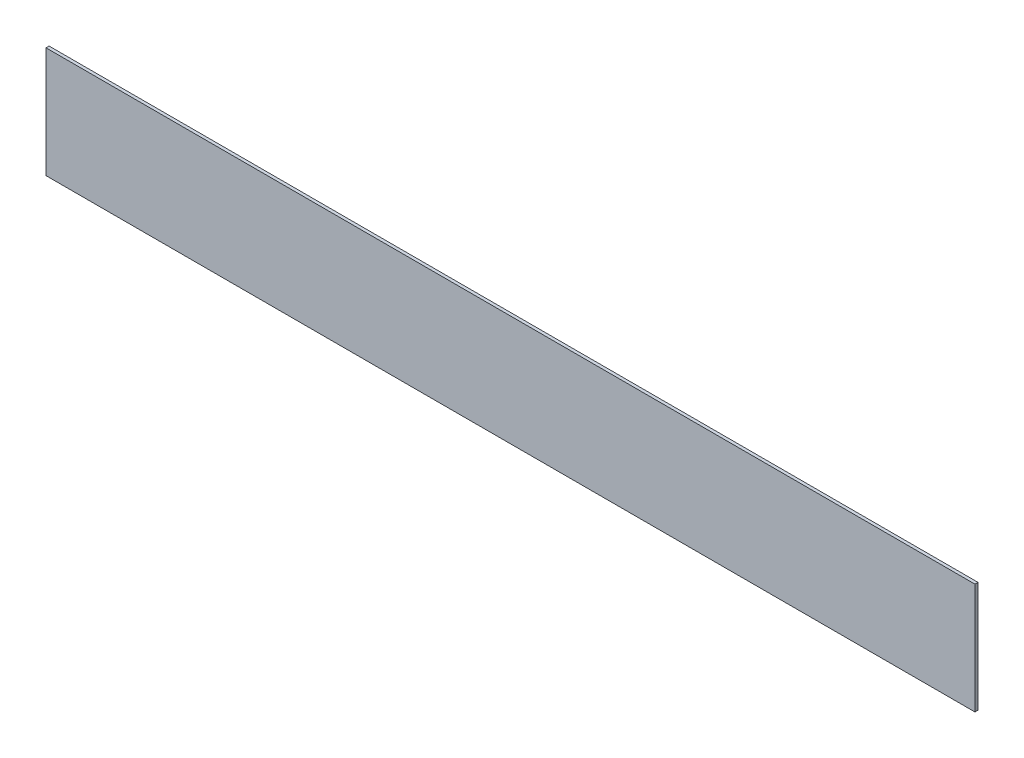
ISO-10303-21;
HEADER;
FILE_DESCRIPTION(('STEP AP214'),'2;1');
FILE_NAME('part.step','',(''),(''),'','','');
FILE_SCHEMA(('AUTOMOTIVE_DESIGN { 1 0 10303 214 1 1 1 1 }'));
ENDSEC;
DATA;
#1=APPLICATION_CONTEXT('core data for automotive mechanical design processes');
#2=APPLICATION_PROTOCOL_DEFINITION('international standard','automotive_design',2000,#1);
#3=PRODUCT_CONTEXT('',#1,'mechanical');
#4=PRODUCT('Part','Part','',(#3));
#5=PRODUCT_RELATED_PRODUCT_CATEGORY('part','',(#4));
#6=PRODUCT_DEFINITION_FORMATION('','',#4);
#7=PRODUCT_DEFINITION_CONTEXT('part definition',#1,'design');
#8=PRODUCT_DEFINITION('design','',#6,#7);
#9=PRODUCT_DEFINITION_SHAPE('','',#8);
#10=(LENGTH_UNIT() NAMED_UNIT(*) SI_UNIT(.MILLI.,.METRE.));
#11=(NAMED_UNIT(*) PLANE_ANGLE_UNIT() SI_UNIT($,.RADIAN.));
#12=(NAMED_UNIT(*) SI_UNIT($,.STERADIAN.) SOLID_ANGLE_UNIT());
#13=UNCERTAINTY_MEASURE_WITH_UNIT(LENGTH_MEASURE(1.E-05),#10,'distance_accuracy_value','');
#14=(GEOMETRIC_REPRESENTATION_CONTEXT(3) GLOBAL_UNCERTAINTY_ASSIGNED_CONTEXT((#13)) GLOBAL_UNIT_ASSIGNED_CONTEXT((#10,
#11,#12)) REPRESENTATION_CONTEXT('',''));
#15=CARTESIAN_POINT('',(0.,0.,0.));
#16=DIRECTION('',(0.,0.,1.));
#17=DIRECTION('',(1.,0.,0.));
#18=AXIS2_PLACEMENT_3D('',#15,#16,#17);
#19=CARTESIAN_POINT('',(158.,249.,27.));
#20=DIRECTION('',(1.,0.,0.));
#21=DIRECTION('',(0.,0.,-1.));
#22=AXIS2_PLACEMENT_3D('',#19,#20,#21);
#23=PLANE('',#22);
#24=DIRECTION('',(0.,-1.,0.));
#25=VECTOR('',#24,1.);
#26=CARTESIAN_POINT('',(158.,249.,26.));
#27=LINE('',#26,#25);
#28=CARTESIAN_POINT('',(158.,285.,26.));
#29=VERTEX_POINT('',#28);
#30=CARTESIAN_POINT('',(158.,249.,26.));
#31=VERTEX_POINT('',#30);
#32=EDGE_CURVE('E102',#29,#31,#27,.T.);
#33=ORIENTED_EDGE('',*,*,#32,.T.);
#34=DIRECTION('',(0.,0.,-1.));
#35=VECTOR('',#34,1.);
#36=CARTESIAN_POINT('',(158.,249.,27.));
#37=LINE('',#36,#35);
#38=CARTESIAN_POINT('',(158.,249.,27.));
#39=VERTEX_POINT('',#38);
#40=EDGE_CURVE('E11',#39,#31,#37,.T.);
#41=ORIENTED_EDGE('',*,*,#40,.F.);
#42=DIRECTION('',(0.,-1.,0.));
#43=VECTOR('',#42,1.);
#44=CARTESIAN_POINT('',(158.,249.,27.));
#45=LINE('',#44,#43);
#46=CARTESIAN_POINT('',(158.,285.,27.));
#47=VERTEX_POINT('',#46);
#48=EDGE_CURVE('E90',#47,#39,#45,.T.);
#49=ORIENTED_EDGE('',*,*,#48,.F.);
#50=DIRECTION('',(0.,0.,-1.));
#51=VECTOR('',#50,1.);
#52=CARTESIAN_POINT('',(158.,285.,27.));
#53=LINE('',#52,#51);
#54=EDGE_CURVE('E98',#47,#29,#53,.T.);
#55=ORIENTED_EDGE('',*,*,#54,.T.);
#56=EDGE_LOOP('',(#33,#41,#49,#55));
#57=FACE_BOUND('',#56,.T.);
#58=ADVANCED_FACE('F39',(#57),#23,.F.);
#59=CARTESIAN_POINT('',(158.,249.,27.));
#60=DIRECTION('',(0.,1.,0.));
#61=DIRECTION('',(0.,0.,1.));
#62=AXIS2_PLACEMENT_3D('',#59,#60,#61);
#63=PLANE('',#62);
#64=DIRECTION('',(1.,0.,0.));
#65=VECTOR('',#64,1.);
#66=CARTESIAN_POINT('',(158.,249.,26.));
#67=LINE('',#66,#65);
#68=CARTESIAN_POINT('',(460.,249.,26.));
#69=VERTEX_POINT('',#68);
#70=EDGE_CURVE('E94',#31,#69,#67,.T.);
#71=ORIENTED_EDGE('',*,*,#70,.T.);
#72=DIRECTION('',(0.,0.,-1.));
#73=VECTOR('',#72,1.);
#74=CARTESIAN_POINT('',(460.,249.,27.));
#75=LINE('',#74,#73);
#76=CARTESIAN_POINT('',(460.,249.,27.));
#77=VERTEX_POINT('',#76);
#78=EDGE_CURVE('E47',#77,#69,#75,.T.);
#79=ORIENTED_EDGE('',*,*,#78,.F.);
#80=DIRECTION('',(1.,0.,0.));
#81=VECTOR('',#80,1.);
#82=CARTESIAN_POINT('',(158.,249.,27.));
#83=LINE('',#82,#81);
#84=EDGE_CURVE('E85',#39,#77,#83,.T.);
#85=ORIENTED_EDGE('',*,*,#84,.F.);
#86=ORIENTED_EDGE('',*,*,#40,.T.);
#87=EDGE_LOOP('',(#71,#79,#85,#86));
#88=FACE_BOUND('',#87,.T.);
#89=ADVANCED_FACE('F93',(#88),#63,.F.);
#90=CARTESIAN_POINT('',(460.,249.,27.));
#91=DIRECTION('',(-1.,0.,0.));
#92=DIRECTION('',(0.,0.,1.));
#93=AXIS2_PLACEMENT_3D('',#90,#91,#92);
#94=PLANE('',#93);
#95=DIRECTION('',(0.,1.,0.));
#96=VECTOR('',#95,1.);
#97=CARTESIAN_POINT('',(460.,249.,26.));
#98=LINE('',#97,#96);
#99=CARTESIAN_POINT('',(460.,285.,26.));
#100=VERTEX_POINT('',#99);
#101=EDGE_CURVE('E72',#69,#100,#98,.T.);
#102=ORIENTED_EDGE('',*,*,#101,.T.);
#103=DIRECTION('',(0.,0.,-1.));
#104=VECTOR('',#103,1.);
#105=CARTESIAN_POINT('',(460.,285.,27.));
#106=LINE('',#105,#104);
#107=CARTESIAN_POINT('',(460.,285.,27.));
#108=VERTEX_POINT('',#107);
#109=EDGE_CURVE('E95',#108,#100,#106,.T.);
#110=ORIENTED_EDGE('',*,*,#109,.F.);
#111=DIRECTION('',(0.,1.,0.));
#112=VECTOR('',#111,1.);
#113=CARTESIAN_POINT('',(460.,249.,27.));
#114=LINE('',#113,#112);
#115=EDGE_CURVE('E88',#77,#108,#114,.T.);
#116=ORIENTED_EDGE('',*,*,#115,.F.);
#117=ORIENTED_EDGE('',*,*,#78,.T.);
#118=EDGE_LOOP('',(#102,#110,#116,#117));
#119=FACE_BOUND('',#118,.T.);
#120=ADVANCED_FACE('F96',(#119),#94,.F.);
#121=CARTESIAN_POINT('',(158.,285.,27.));
#122=DIRECTION('',(0.,-1.,0.));
#123=DIRECTION('',(0.,0.,-1.));
#124=AXIS2_PLACEMENT_3D('',#121,#122,#123);
#125=PLANE('',#124);
#126=DIRECTION('',(-1.,0.,0.));
#127=VECTOR('',#126,1.);
#128=CARTESIAN_POINT('',(158.,285.,26.));
#129=LINE('',#128,#127);
#130=EDGE_CURVE('E78',#100,#29,#129,.T.);
#131=ORIENTED_EDGE('',*,*,#130,.T.);
#132=ORIENTED_EDGE('',*,*,#54,.F.);
#133=DIRECTION('',(-1.,0.,0.));
#134=VECTOR('',#133,1.);
#135=CARTESIAN_POINT('',(158.,285.,27.));
#136=LINE('',#135,#134);
#137=EDGE_CURVE('E55',#108,#47,#136,.T.);
#138=ORIENTED_EDGE('',*,*,#137,.F.);
#139=ORIENTED_EDGE('',*,*,#109,.T.);
#140=EDGE_LOOP('',(#131,#132,#138,#139));
#141=FACE_BOUND('',#140,.T.);
#142=ADVANCED_FACE('F109',(#141),#125,.F.);
#143=CARTESIAN_POINT('',(0.,0.,27.));
#144=DIRECTION('',(0.,0.,-1.));
#145=DIRECTION('',(-1.,0.,0.));
#146=AXIS2_PLACEMENT_3D('',#143,#144,#145);
#147=PLANE('',#146);
#148=ORIENTED_EDGE('',*,*,#48,.T.);
#149=ORIENTED_EDGE('',*,*,#84,.T.);
#150=ORIENTED_EDGE('',*,*,#115,.T.);
#151=ORIENTED_EDGE('',*,*,#137,.T.);
#152=EDGE_LOOP('',(#148,#149,#150,#151));
#153=FACE_BOUND('',#152,.T.);
#154=ADVANCED_FACE('F86',(#153),#147,.F.);
#155=CARTESIAN_POINT('',(0.,0.,26.));
#156=DIRECTION('',(0.,0.,-1.));
#157=DIRECTION('',(-1.,0.,0.));
#158=AXIS2_PLACEMENT_3D('',#155,#156,#157);
#159=PLANE('',#158);
#160=ORIENTED_EDGE('',*,*,#32,.F.);
#161=ORIENTED_EDGE('',*,*,#130,.F.);
#162=ORIENTED_EDGE('',*,*,#101,.F.);
#163=ORIENTED_EDGE('',*,*,#70,.F.);
#164=EDGE_LOOP('',(#160,#161,#162,#163));
#165=FACE_BOUND('',#164,.T.);
#166=ADVANCED_FACE('F112',(#165),#159,.T.);
#167=CLOSED_SHELL('',(#58,#89,#120,#142,#154,#166));
#168=MANIFOLD_SOLID_BREP('B2',#167);
#169=ADVANCED_BREP_SHAPE_REPRESENTATION('',(#18,#168),#14);
#170=SHAPE_DEFINITION_REPRESENTATION(#9,#169);
ENDSEC;
END-ISO-10303-21;
